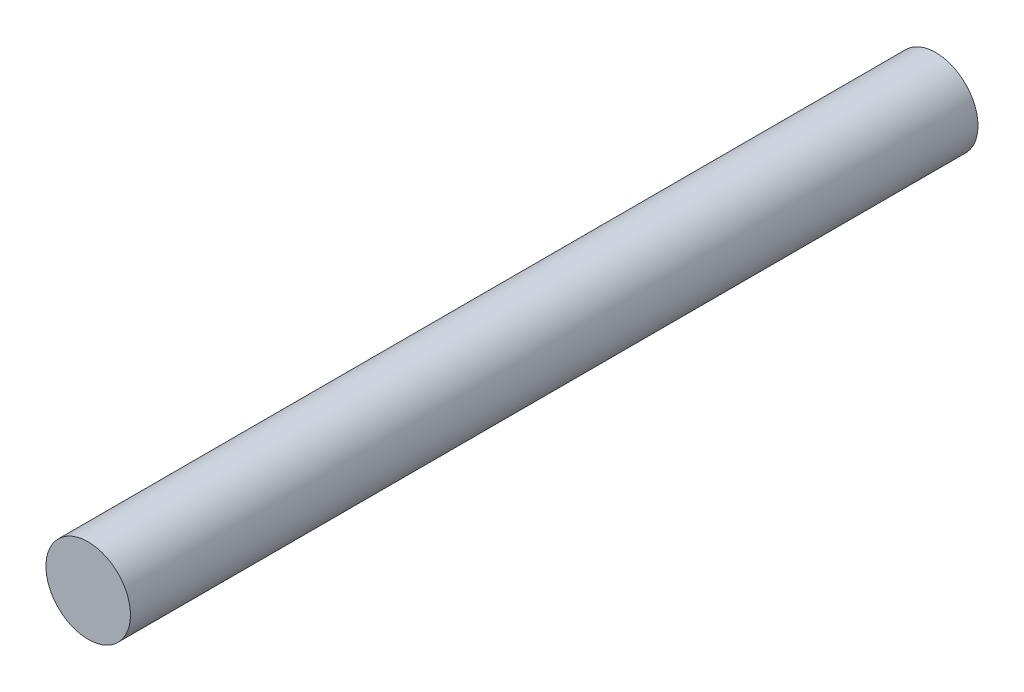
ISO-10303-21;
HEADER;
FILE_DESCRIPTION(('STEP AP214'),'2;1');
FILE_NAME('part.step','',(''),(''),'','','');
FILE_SCHEMA(('AUTOMOTIVE_DESIGN { 1 0 10303 214 1 1 1 1 }'));
ENDSEC;
DATA;
#1=APPLICATION_CONTEXT('core data for automotive mechanical design processes');
#2=APPLICATION_PROTOCOL_DEFINITION('international standard','automotive_design',2000,#1);
#3=PRODUCT_CONTEXT('',#1,'mechanical');
#4=PRODUCT('Part','Part','',(#3));
#5=PRODUCT_RELATED_PRODUCT_CATEGORY('part','',(#4));
#6=PRODUCT_DEFINITION_FORMATION('','',#4);
#7=PRODUCT_DEFINITION_CONTEXT('part definition',#1,'design');
#8=PRODUCT_DEFINITION('design','',#6,#7);
#9=PRODUCT_DEFINITION_SHAPE('','',#8);
#10=(LENGTH_UNIT() NAMED_UNIT(*) SI_UNIT(.MILLI.,.METRE.));
#11=(NAMED_UNIT(*) PLANE_ANGLE_UNIT() SI_UNIT($,.RADIAN.));
#12=(NAMED_UNIT(*) SI_UNIT($,.STERADIAN.) SOLID_ANGLE_UNIT());
#13=UNCERTAINTY_MEASURE_WITH_UNIT(LENGTH_MEASURE(1.E-05),#10,'distance_accuracy_value','');
#14=(GEOMETRIC_REPRESENTATION_CONTEXT(3) GLOBAL_UNCERTAINTY_ASSIGNED_CONTEXT((#13)) GLOBAL_UNIT_ASSIGNED_CONTEXT((#10,
#11,#12)) REPRESENTATION_CONTEXT('',''));
#15=CARTESIAN_POINT('',(0.,0.,0.));
#16=DIRECTION('',(0.,0.,1.));
#17=DIRECTION('',(1.,0.,0.));
#18=AXIS2_PLACEMENT_3D('',#15,#16,#17);
#19=CARTESIAN_POINT('',(0.,0.,2000.));
#20=DIRECTION('',(0.,0.,-1.));
#21=DIRECTION('',(-1.,0.,0.));
#22=AXIS2_PLACEMENT_3D('',#19,#20,#21);
#23=CYLINDRICAL_SURFACE('',#22,99.7465);
#24=CARTESIAN_POINT('',(0.,0.,2000.));
#25=DIRECTION('',(0.,0.,1.));
#26=DIRECTION('',(1.,0.,0.));
#27=AXIS2_PLACEMENT_3D('',#24,#25,#26);
#28=CIRCLE('',#27,99.7465);
#29=CARTESIAN_POINT('',(99.7465,0.,2000.));
#30=VERTEX_POINT('',#29);
#31=EDGE_CURVE('E10',#30,#30,#28,.T.);
#32=ORIENTED_EDGE('',*,*,#31,.F.);
#33=EDGE_LOOP('',(#32));
#34=FACE_BOUND('',#33,.T.);
#35=CARTESIAN_POINT('',(0.,0.,0.));
#36=DIRECTION('',(0.,0.,1.));
#37=DIRECTION('',(1.,0.,0.));
#38=AXIS2_PLACEMENT_3D('',#35,#36,#37);
#39=CIRCLE('',#38,99.7465);
#40=CARTESIAN_POINT('',(99.7465,0.,0.));
#41=VERTEX_POINT('',#40);
#42=EDGE_CURVE('E34',#41,#41,#39,.T.);
#43=ORIENTED_EDGE('',*,*,#42,.T.);
#44=EDGE_LOOP('',(#43));
#45=FACE_BOUND('',#44,.T.);
#46=ADVANCED_FACE('F31',(#34,#45),#23,.T.);
#47=CARTESIAN_POINT('',(0.,0.,2000.));
#48=DIRECTION('',(0.,0.,1.));
#49=DIRECTION('',(1.,0.,0.));
#50=AXIS2_PLACEMENT_3D('',#47,#48,#49);
#51=PLANE('',#50);
#52=ORIENTED_EDGE('',*,*,#31,.T.);
#53=EDGE_LOOP('',(#52));
#54=FACE_BOUND('',#53,.T.);
#55=ADVANCED_FACE('F46',(#54),#51,.T.);
#56=CARTESIAN_POINT('',(0.,0.,0.));
#57=DIRECTION('',(0.,0.,1.));
#58=DIRECTION('',(1.,0.,0.));
#59=AXIS2_PLACEMENT_3D('',#56,#57,#58);
#60=PLANE('',#59);
#61=ORIENTED_EDGE('',*,*,#42,.F.);
#62=EDGE_LOOP('',(#61));
#63=FACE_BOUND('',#62,.T.);
#64=ADVANCED_FACE('F44',(#63),#60,.F.);
#65=CLOSED_SHELL('',(#46,#55,#64));
#66=MANIFOLD_SOLID_BREP('B2',#65);
#67=ADVANCED_BREP_SHAPE_REPRESENTATION('',(#18,#66),#14);
#68=SHAPE_DEFINITION_REPRESENTATION(#9,#67);
ENDSEC;
END-ISO-10303-21;
